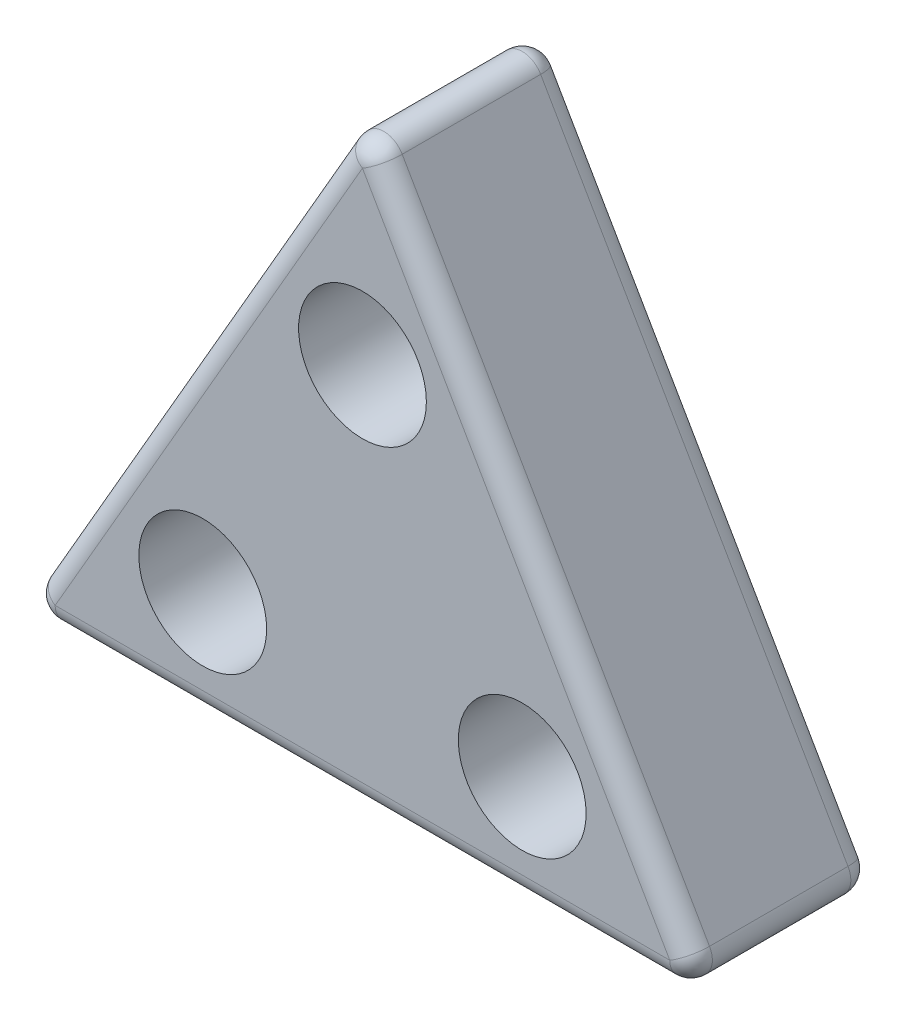
ISO-10303-21;
HEADER;
FILE_DESCRIPTION(('STEP AP214'),'2;1');
FILE_NAME('part.step','',(''),(''),'','','');
FILE_SCHEMA(('AUTOMOTIVE_DESIGN { 1 0 10303 214 1 1 1 1 }'));
ENDSEC;
DATA;
#1=APPLICATION_CONTEXT('core data for automotive mechanical design processes');
#2=APPLICATION_PROTOCOL_DEFINITION('international standard','automotive_design',2000,#1);
#3=PRODUCT_CONTEXT('',#1,'mechanical');
#4=PRODUCT('Part','Part','',(#3));
#5=PRODUCT_RELATED_PRODUCT_CATEGORY('part','',(#4));
#6=PRODUCT_DEFINITION_FORMATION('','',#4);
#7=PRODUCT_DEFINITION_CONTEXT('part definition',#1,'design');
#8=PRODUCT_DEFINITION('design','',#6,#7);
#9=PRODUCT_DEFINITION_SHAPE('','',#8);
#10=(LENGTH_UNIT() NAMED_UNIT(*) SI_UNIT(.MILLI.,.METRE.));
#11=(NAMED_UNIT(*) PLANE_ANGLE_UNIT() SI_UNIT($,.RADIAN.));
#12=(NAMED_UNIT(*) SI_UNIT($,.STERADIAN.) SOLID_ANGLE_UNIT());
#13=UNCERTAINTY_MEASURE_WITH_UNIT(LENGTH_MEASURE(1.E-05),#10,'distance_accuracy_value','');
#14=(GEOMETRIC_REPRESENTATION_CONTEXT(3) GLOBAL_UNCERTAINTY_ASSIGNED_CONTEXT((#13)) GLOBAL_UNIT_ASSIGNED_CONTEXT((#10,
#11,#12)) REPRESENTATION_CONTEXT('',''));
#15=CARTESIAN_POINT('',(0.,0.,0.));
#16=DIRECTION('',(0.,0.,1.));
#17=DIRECTION('',(1.,0.,0.));
#18=AXIS2_PLACEMENT_3D('',#15,#16,#17);
#19=CARTESIAN_POINT('',(0.,20.9903810567666,8.5));
#20=DIRECTION('',(0.,0.,-1.));
#21=DIRECTION('',(-1.,0.,0.));
#22=AXIS2_PLACEMENT_3D('',#19,#20,#21);
#23=PLANE('',#22);
#24=DIRECTION('',(-0.499999999999998,-0.86602540378444,0.));
#25=VECTOR('',#24,1.);
#26=CARTESIAN_POINT('',(0.,20.9903810567666,8.5));
#27=LINE('',#26,#25);
#28=CARTESIAN_POINT('',(0.,20.9903810567666,8.5));
#29=VERTEX_POINT('',#28);
#30=CARTESIAN_POINT('',(-14.4282032302755,-4.,8.5));
#31=VERTEX_POINT('',#30);
#32=EDGE_CURVE('E58',#29,#31,#27,.T.);
#33=ORIENTED_EDGE('',*,*,#32,.T.);
#34=DIRECTION('',(1.,0.,0.));
#35=VECTOR('',#34,1.);
#36=CARTESIAN_POINT('',(0.,-4.,8.5));
#37=LINE('',#36,#35);
#38=CARTESIAN_POINT('',(14.4282032302755,-4.,8.5));
#39=VERTEX_POINT('',#38);
#40=EDGE_CURVE('E122',#31,#39,#37,.T.);
#41=ORIENTED_EDGE('',*,*,#40,.T.);
#42=DIRECTION('',(-0.500000000000001,0.866025403784438,0.));
#43=VECTOR('',#42,1.);
#44=CARTESIAN_POINT('',(0.,20.9903810567666,8.5));
#45=LINE('',#44,#43);
#46=EDGE_CURVE('E62',#39,#29,#45,.T.);
#47=ORIENTED_EDGE('',*,*,#46,.T.);
#48=EDGE_LOOP('',(#33,#41,#47));
#49=FACE_BOUND('',#48,.T.);
#50=CARTESIAN_POINT('',(-7.5,0.,8.5));
#51=DIRECTION('',(0.,0.,1.));
#52=DIRECTION('',(1.,0.,0.));
#53=AXIS2_PLACEMENT_3D('',#50,#51,#52);
#54=CIRCLE('',#53,3.);
#55=CARTESIAN_POINT('',(-4.5,0.,8.5));
#56=VERTEX_POINT('',#55);
#57=EDGE_CURVE('E205',#56,#56,#54,.T.);
#58=ORIENTED_EDGE('',*,*,#57,.F.);
#59=EDGE_LOOP('',(#58));
#60=FACE_BOUND('',#59,.T.);
#61=CARTESIAN_POINT('',(7.5,0.,8.5));
#62=DIRECTION('',(0.,0.,1.));
#63=DIRECTION('',(1.,0.,0.));
#64=AXIS2_PLACEMENT_3D('',#61,#62,#63);
#65=CIRCLE('',#64,3.);
#66=CARTESIAN_POINT('',(10.5,0.,8.5));
#67=VERTEX_POINT('',#66);
#68=EDGE_CURVE('E199',#67,#67,#65,.T.);
#69=ORIENTED_EDGE('',*,*,#68,.F.);
#70=EDGE_LOOP('',(#69));
#71=FACE_BOUND('',#70,.T.);
#72=CARTESIAN_POINT('',(0.,12.9903810567666,8.5));
#73=DIRECTION('',(0.,0.,1.));
#74=DIRECTION('',(1.,0.,0.));
#75=AXIS2_PLACEMENT_3D('',#72,#73,#74);
#76=CIRCLE('',#75,3.);
#77=CARTESIAN_POINT('',(2.99999999999997,12.9903810567666,8.5));
#78=VERTEX_POINT('',#77);
#79=EDGE_CURVE('E191',#78,#78,#76,.T.);
#80=ORIENTED_EDGE('',*,*,#79,.F.);
#81=EDGE_LOOP('',(#80));
#82=FACE_BOUND('',#81,.T.);
#83=ADVANCED_FACE('F41',(#49,#60,#71,#82),#23,.F.);
#84=CARTESIAN_POINT('',(0.,20.9903810567666,0.));
#85=DIRECTION('',(0.,0.,-1.));
#86=DIRECTION('',(-1.,0.,0.));
#87=AXIS2_PLACEMENT_3D('',#84,#85,#86);
#88=PLANE('',#87);
#89=DIRECTION('',(-0.500000000000001,0.866025403784438,0.));
#90=VECTOR('',#89,1.);
#91=CARTESIAN_POINT('',(14.4282032302755,-4.00000000000001,0.));
#92=LINE('',#91,#90);
#93=CARTESIAN_POINT('',(0.,20.9903810567666,0.));
#94=VERTEX_POINT('',#93);
#95=CARTESIAN_POINT('',(14.4282032302755,-4.,0.));
#96=VERTEX_POINT('',#95);
#97=EDGE_CURVE('E225',#94,#96,#92,.F.);
#98=ORIENTED_EDGE('',*,*,#97,.T.);
#99=DIRECTION('',(1.,0.,0.));
#100=VECTOR('',#99,1.);
#101=CARTESIAN_POINT('',(-14.4282032302755,-4.,0.));
#102=LINE('',#101,#100);
#103=CARTESIAN_POINT('',(-14.4282032302755,-4.,0.));
#104=VERTEX_POINT('',#103);
#105=EDGE_CURVE('E229',#96,#104,#102,.F.);
#106=ORIENTED_EDGE('',*,*,#105,.T.);
#107=DIRECTION('',(-0.499999999999998,-0.86602540378444,0.));
#108=VECTOR('',#107,1.);
#109=CARTESIAN_POINT('',(0.,20.9903810567666,0.));
#110=LINE('',#109,#108);
#111=EDGE_CURVE('E227',#104,#94,#110,.F.);
#112=ORIENTED_EDGE('',*,*,#111,.T.);
#113=EDGE_LOOP('',(#98,#106,#112));
#114=FACE_BOUND('',#113,.T.);
#115=CARTESIAN_POINT('',(7.5,0.,0.));
#116=DIRECTION('',(0.,0.,1.));
#117=DIRECTION('',(1.,0.,0.));
#118=AXIS2_PLACEMENT_3D('',#115,#116,#117);
#119=CIRCLE('',#118,3.);
#120=CARTESIAN_POINT('',(10.5,0.,0.));
#121=VERTEX_POINT('',#120);
#122=EDGE_CURVE('E196',#121,#121,#119,.T.);
#123=ORIENTED_EDGE('',*,*,#122,.T.);
#124=EDGE_LOOP('',(#123));
#125=FACE_BOUND('',#124,.T.);
#126=CARTESIAN_POINT('',(-7.5,0.,0.));
#127=DIRECTION('',(0.,0.,1.));
#128=DIRECTION('',(1.,0.,0.));
#129=AXIS2_PLACEMENT_3D('',#126,#127,#128);
#130=CIRCLE('',#129,3.);
#131=CARTESIAN_POINT('',(-4.5,0.,0.));
#132=VERTEX_POINT('',#131);
#133=EDGE_CURVE('E202',#132,#132,#130,.T.);
#134=ORIENTED_EDGE('',*,*,#133,.T.);
#135=EDGE_LOOP('',(#134));
#136=FACE_BOUND('',#135,.T.);
#137=CARTESIAN_POINT('',(0.,12.9903810567666,0.));
#138=DIRECTION('',(0.,0.,1.));
#139=DIRECTION('',(1.,0.,0.));
#140=AXIS2_PLACEMENT_3D('',#137,#138,#139);
#141=CIRCLE('',#140,3.);
#142=CARTESIAN_POINT('',(2.99999999999997,12.9903810567666,0.));
#143=VERTEX_POINT('',#142);
#144=EDGE_CURVE('E184',#143,#143,#141,.T.);
#145=ORIENTED_EDGE('',*,*,#144,.T.);
#146=EDGE_LOOP('',(#145));
#147=FACE_BOUND('',#146,.T.);
#148=ADVANCED_FACE('F267',(#114,#125,#136,#147),#88,.T.);
#149=CARTESIAN_POINT('',(0.,20.9903810567666,8.5));
#150=DIRECTION('',(0.,0.,-1.));
#151=DIRECTION('',(-1.,0.,0.));
#152=AXIS2_PLACEMENT_3D('',#149,#150,#151);
#153=CYLINDRICAL_SURFACE('',#152,1.);
#154=DIRECTION('',(0.,0.,-1.));
#155=VECTOR('',#154,1.);
#156=CARTESIAN_POINT('',(0.866025403784391,21.4903810567666,8.5));
#157=LINE('',#156,#155);
#158=CARTESIAN_POINT('',(0.866025403784391,21.4903810567666,7.5));
#159=VERTEX_POINT('',#158);
#160=CARTESIAN_POINT('',(0.866025403784391,21.4903810567666,1.));
#161=VERTEX_POINT('',#160);
#162=EDGE_CURVE('E117',#159,#161,#157,.T.);
#163=ORIENTED_EDGE('',*,*,#162,.T.);
#164=CARTESIAN_POINT('',(0.,20.9903810567666,1.));
#165=DIRECTION('',(0.,0.,-1.));
#166=DIRECTION('',(-1.,0.,0.));
#167=AXIS2_PLACEMENT_3D('',#164,#165,#166);
#168=CIRCLE('',#167,1.);
#169=CARTESIAN_POINT('',(-0.866025403784487,21.4903810567666,1.));
#170=VERTEX_POINT('',#169);
#171=EDGE_CURVE('E242',#161,#170,#168,.F.);
#172=ORIENTED_EDGE('',*,*,#171,.T.);
#173=DIRECTION('',(0.,0.,-1.));
#174=VECTOR('',#173,1.);
#175=CARTESIAN_POINT('',(-0.866025403784487,21.4903810567666,8.5));
#176=LINE('',#175,#174);
#177=CARTESIAN_POINT('',(-0.866025403784487,21.4903810567666,7.5));
#178=VERTEX_POINT('',#177);
#179=EDGE_CURVE('E142',#178,#170,#176,.T.);
#180=ORIENTED_EDGE('',*,*,#179,.F.);
#181=CARTESIAN_POINT('',(0.,20.9903810567666,7.5));
#182=DIRECTION('',(0.,0.,-1.));
#183=DIRECTION('',(-1.,0.,0.));
#184=AXIS2_PLACEMENT_3D('',#181,#182,#183);
#185=CIRCLE('',#184,1.);
#186=EDGE_CURVE('E240',#178,#159,#185,.T.);
#187=ORIENTED_EDGE('',*,*,#186,.T.);
#188=EDGE_LOOP('',(#163,#172,#180,#187));
#189=FACE_BOUND('',#188,.T.);
#190=ADVANCED_FACE('F273',(#189),#153,.T.);
#191=CARTESIAN_POINT('',(-15.2942286340599,-3.5,8.5));
#192=DIRECTION('',(0.86602540378444,-0.499999999999998,0.));
#193=DIRECTION('',(0.499999999999998,0.86602540378444,0.));
#194=AXIS2_PLACEMENT_3D('',#191,#192,#193);
#195=PLANE('',#194);
#196=ORIENTED_EDGE('',*,*,#179,.T.);
#197=DIRECTION('',(-0.499999999999998,-0.86602540378444,0.));
#198=VECTOR('',#197,1.);
#199=CARTESIAN_POINT('',(-15.2942286340599,-3.5,1.));
#200=LINE('',#199,#198);
#201=CARTESIAN_POINT('',(-15.2942286340599,-3.5,1.));
#202=VERTEX_POINT('',#201);
#203=EDGE_CURVE('E238',#170,#202,#200,.T.);
#204=ORIENTED_EDGE('',*,*,#203,.T.);
#205=DIRECTION('',(0.,0.,-1.));
#206=VECTOR('',#205,1.);
#207=CARTESIAN_POINT('',(-15.2942286340599,-3.5,8.5));
#208=LINE('',#207,#206);
#209=CARTESIAN_POINT('',(-15.2942286340599,-3.5,7.5));
#210=VERTEX_POINT('',#209);
#211=EDGE_CURVE('E215',#210,#202,#208,.T.);
#212=ORIENTED_EDGE('',*,*,#211,.F.);
#213=DIRECTION('',(-0.499999999999998,-0.86602540378444,0.));
#214=VECTOR('',#213,1.);
#215=CARTESIAN_POINT('',(-15.2942286340599,-3.5,7.5));
#216=LINE('',#215,#214);
#217=EDGE_CURVE('E236',#210,#178,#216,.F.);
#218=ORIENTED_EDGE('',*,*,#217,.T.);
#219=EDGE_LOOP('',(#196,#204,#212,#218));
#220=FACE_BOUND('',#219,.T.);
#221=ADVANCED_FACE('F288',(#220),#195,.F.);
#222=CARTESIAN_POINT('',(-14.4282032302755,-4.,8.5));
#223=DIRECTION('',(0.,0.,-1.));
#224=DIRECTION('',(-1.,0.,0.));
#225=AXIS2_PLACEMENT_3D('',#222,#223,#224);
#226=CYLINDRICAL_SURFACE('',#225,1.);
#227=ORIENTED_EDGE('',*,*,#211,.T.);
#228=CARTESIAN_POINT('',(-14.4282032302755,-4.,1.));
#229=DIRECTION('',(0.,0.,-1.));
#230=DIRECTION('',(-1.,0.,0.));
#231=AXIS2_PLACEMENT_3D('',#228,#229,#230);
#232=CIRCLE('',#231,1.);
#233=CARTESIAN_POINT('',(-14.4282032302755,-5.,1.));
#234=VERTEX_POINT('',#233);
#235=EDGE_CURVE('E234',#202,#234,#232,.F.);
#236=ORIENTED_EDGE('',*,*,#235,.T.);
#237=DIRECTION('',(0.,0.,-1.));
#238=VECTOR('',#237,1.);
#239=CARTESIAN_POINT('',(-14.4282032302755,-5.,8.5));
#240=LINE('',#239,#238);
#241=CARTESIAN_POINT('',(-14.4282032302755,-5.,7.5));
#242=VERTEX_POINT('',#241);
#243=EDGE_CURVE('E212',#242,#234,#240,.T.);
#244=ORIENTED_EDGE('',*,*,#243,.F.);
#245=CARTESIAN_POINT('',(-14.4282032302755,-4.,7.5));
#246=DIRECTION('',(0.,0.,-1.));
#247=DIRECTION('',(-1.,0.,0.));
#248=AXIS2_PLACEMENT_3D('',#245,#246,#247);
#249=CIRCLE('',#248,1.);
#250=EDGE_CURVE('E232',#242,#210,#249,.T.);
#251=ORIENTED_EDGE('',*,*,#250,.T.);
#252=EDGE_LOOP('',(#227,#236,#244,#251));
#253=FACE_BOUND('',#252,.T.);
#254=ADVANCED_FACE('F254',(#253),#226,.T.);
#255=CARTESIAN_POINT('',(-14.4282032302755,-5.,8.5));
#256=DIRECTION('',(0.,1.,0.));
#257=DIRECTION('',(-1.,0.,0.));
#258=AXIS2_PLACEMENT_3D('',#255,#256,#257);
#259=PLANE('',#258);
#260=ORIENTED_EDGE('',*,*,#243,.T.);
#261=DIRECTION('',(1.,0.,0.));
#262=VECTOR('',#261,1.);
#263=CARTESIAN_POINT('',(14.4282032302755,-5.,1.));
#264=LINE('',#263,#262);
#265=CARTESIAN_POINT('',(14.4282032302755,-5.,1.));
#266=VERTEX_POINT('',#265);
#267=EDGE_CURVE('E223',#234,#266,#264,.T.);
#268=ORIENTED_EDGE('',*,*,#267,.T.);
#269=DIRECTION('',(0.,0.,-1.));
#270=VECTOR('',#269,1.);
#271=CARTESIAN_POINT('',(14.4282032302755,-5.,8.5));
#272=LINE('',#271,#270);
#273=CARTESIAN_POINT('',(14.4282032302755,-5.,7.5));
#274=VERTEX_POINT('',#273);
#275=EDGE_CURVE('E134',#274,#266,#272,.T.);
#276=ORIENTED_EDGE('',*,*,#275,.F.);
#277=DIRECTION('',(1.,0.,0.));
#278=VECTOR('',#277,1.);
#279=CARTESIAN_POINT('',(-14.4282032302755,-5.,7.5));
#280=LINE('',#279,#278);
#281=EDGE_CURVE('E221',#274,#242,#280,.F.);
#282=ORIENTED_EDGE('',*,*,#281,.T.);
#283=EDGE_LOOP('',(#260,#268,#276,#282));
#284=FACE_BOUND('',#283,.T.);
#285=ADVANCED_FACE('F252',(#284),#259,.F.);
#286=CARTESIAN_POINT('',(14.4282032302755,-4.,8.5));
#287=DIRECTION('',(0.,0.,-1.));
#288=DIRECTION('',(-1.,0.,0.));
#289=AXIS2_PLACEMENT_3D('',#286,#287,#288);
#290=CYLINDRICAL_SURFACE('',#289,0.999999999999998);
#291=ORIENTED_EDGE('',*,*,#275,.T.);
#292=CARTESIAN_POINT('',(14.4282032302755,-4.,1.));
#293=DIRECTION('',(0.,0.,-1.));
#294=DIRECTION('',(-1.,0.,0.));
#295=AXIS2_PLACEMENT_3D('',#292,#293,#294);
#296=CIRCLE('',#295,0.999999999999998);
#297=CARTESIAN_POINT('',(15.29422863406,-3.5,1.));
#298=VERTEX_POINT('',#297);
#299=EDGE_CURVE('E133',#266,#298,#296,.F.);
#300=ORIENTED_EDGE('',*,*,#299,.T.);
#301=DIRECTION('',(0.,0.,-1.));
#302=VECTOR('',#301,1.);
#303=CARTESIAN_POINT('',(15.29422863406,-3.5,8.5));
#304=LINE('',#303,#302);
#305=CARTESIAN_POINT('',(15.29422863406,-3.5,7.5));
#306=VERTEX_POINT('',#305);
#307=EDGE_CURVE('E115',#306,#298,#304,.T.);
#308=ORIENTED_EDGE('',*,*,#307,.F.);
#309=CARTESIAN_POINT('',(14.4282032302755,-4.,7.5));
#310=DIRECTION('',(0.,0.,-1.));
#311=DIRECTION('',(-1.,0.,0.));
#312=AXIS2_PLACEMENT_3D('',#309,#310,#311);
#313=CIRCLE('',#312,0.999999999999998);
#314=EDGE_CURVE('E130',#306,#274,#313,.T.);
#315=ORIENTED_EDGE('',*,*,#314,.T.);
#316=EDGE_LOOP('',(#291,#300,#308,#315));
#317=FACE_BOUND('',#316,.T.);
#318=ADVANCED_FACE('F129',(#317),#290,.T.);
#319=CARTESIAN_POINT('',(0.866025403784391,21.4903810567666,8.5));
#320=DIRECTION('',(-0.866025403784438,-0.500000000000001,0.));
#321=DIRECTION('',(0.500000000000001,-0.866025403784438,0.));
#322=AXIS2_PLACEMENT_3D('',#319,#320,#321);
#323=PLANE('',#322);
#324=ORIENTED_EDGE('',*,*,#307,.T.);
#325=DIRECTION('',(-0.500000000000001,0.866025403784438,0.));
#326=VECTOR('',#325,1.);
#327=CARTESIAN_POINT('',(0.866025403784391,21.4903810567666,1.));
#328=LINE('',#327,#326);
#329=EDGE_CURVE('E11',#298,#161,#328,.T.);
#330=ORIENTED_EDGE('',*,*,#329,.T.);
#331=ORIENTED_EDGE('',*,*,#162,.F.);
#332=DIRECTION('',(-0.500000000000001,0.866025403784438,0.));
#333=VECTOR('',#332,1.);
#334=CARTESIAN_POINT('',(0.866025403784391,21.4903810567666,7.5));
#335=LINE('',#334,#333);
#336=EDGE_CURVE('E50',#159,#306,#335,.F.);
#337=ORIENTED_EDGE('',*,*,#336,.T.);
#338=EDGE_LOOP('',(#324,#330,#331,#337));
#339=FACE_BOUND('',#338,.T.);
#340=ADVANCED_FACE('F114',(#339),#323,.F.);
#341=CARTESIAN_POINT('',(-7.5,0.,8.5));
#342=DIRECTION('',(0.,0.,-1.));
#343=DIRECTION('',(-1.,0.,0.));
#344=AXIS2_PLACEMENT_3D('',#341,#342,#343);
#345=CYLINDRICAL_SURFACE('',#344,3.);
#346=ORIENTED_EDGE('',*,*,#57,.T.);
#347=EDGE_LOOP('',(#346));
#348=FACE_BOUND('',#347,.T.);
#349=ORIENTED_EDGE('',*,*,#133,.F.);
#350=EDGE_LOOP('',(#349));
#351=FACE_BOUND('',#350,.T.);
#352=ADVANCED_FACE('F277',(#348,#351),#345,.F.);
#353=CARTESIAN_POINT('',(7.5,0.,8.5));
#354=DIRECTION('',(0.,0.,-1.));
#355=DIRECTION('',(-1.,0.,0.));
#356=AXIS2_PLACEMENT_3D('',#353,#354,#355);
#357=CYLINDRICAL_SURFACE('',#356,3.);
#358=ORIENTED_EDGE('',*,*,#68,.T.);
#359=EDGE_LOOP('',(#358));
#360=FACE_BOUND('',#359,.T.);
#361=ORIENTED_EDGE('',*,*,#122,.F.);
#362=EDGE_LOOP('',(#361));
#363=FACE_BOUND('',#362,.T.);
#364=ADVANCED_FACE('F388',(#360,#363),#357,.F.);
#365=CARTESIAN_POINT('',(0.,12.9903810567666,8.5));
#366=DIRECTION('',(0.,0.,-1.));
#367=DIRECTION('',(-1.,0.,0.));
#368=AXIS2_PLACEMENT_3D('',#365,#366,#367);
#369=CYLINDRICAL_SURFACE('',#368,3.);
#370=ORIENTED_EDGE('',*,*,#79,.T.);
#371=EDGE_LOOP('',(#370));
#372=FACE_BOUND('',#371,.T.);
#373=ORIENTED_EDGE('',*,*,#144,.F.);
#374=EDGE_LOOP('',(#373));
#375=FACE_BOUND('',#374,.T.);
#376=ADVANCED_FACE('F314',(#372,#375),#369,.F.);
#377=CARTESIAN_POINT('',(-14.4282032302755,-4.,1.));
#378=DIRECTION('',(0.499999999999998,0.86602540378444,0.));
#379=DIRECTION('',(-0.86602540378444,0.499999999999998,0.));
#380=AXIS2_PLACEMENT_3D('',#377,#378,#379);
#381=CYLINDRICAL_SURFACE('',#380,1.);
#382=CARTESIAN_POINT('',(-14.4282032302755,-4.,1.));
#383=DIRECTION('',(-0.499999999999998,-0.86602540378444,0.));
#384=DIRECTION('',(0.86602540378444,-0.499999999999998,0.));
#385=AXIS2_PLACEMENT_3D('',#382,#383,#384);
#386=CIRCLE('',#385,1.);
#387=EDGE_CURVE('E149',#202,#104,#386,.T.);
#388=ORIENTED_EDGE('',*,*,#387,.F.);
#389=ORIENTED_EDGE('',*,*,#203,.F.);
#390=CARTESIAN_POINT('',(0.,20.9903810567666,1.));
#391=DIRECTION('',(0.499999999999998,0.86602540378444,0.));
#392=DIRECTION('',(-0.86602540378444,0.499999999999998,0.));
#393=AXIS2_PLACEMENT_3D('',#390,#391,#392);
#394=CIRCLE('',#393,1.);
#395=EDGE_CURVE('E177',#94,#170,#394,.T.);
#396=ORIENTED_EDGE('',*,*,#395,.F.);
#397=ORIENTED_EDGE('',*,*,#111,.F.);
#398=EDGE_LOOP('',(#388,#389,#396,#397));
#399=FACE_BOUND('',#398,.T.);
#400=ADVANCED_FACE('F311',(#399),#381,.T.);
#401=CARTESIAN_POINT('',(-14.4282032302755,-4.,1.));
#402=DIRECTION('',(0.,0.,-1.));
#403=DIRECTION('',(-1.,0.,0.));
#404=AXIS2_PLACEMENT_3D('',#401,#402,#403);
#405=SPHERICAL_SURFACE('',#404,1.);
#406=ORIENTED_EDGE('',*,*,#235,.F.);
#407=ORIENTED_EDGE('',*,*,#387,.T.);
#408=CARTESIAN_POINT('',(-14.4282032302755,-4.,1.));
#409=DIRECTION('',(1.,0.,0.));
#410=DIRECTION('',(0.,0.,-1.));
#411=AXIS2_PLACEMENT_3D('',#408,#409,#410);
#412=CIRCLE('',#411,1.);
#413=EDGE_CURVE('E176',#234,#104,#412,.T.);
#414=ORIENTED_EDGE('',*,*,#413,.F.);
#415=EDGE_LOOP('',(#406,#407,#414));
#416=FACE_BOUND('',#415,.T.);
#417=ADVANCED_FACE('F308',(#416),#405,.T.);
#418=CARTESIAN_POINT('',(0.,20.9903810567666,1.));
#419=DIRECTION('',(0.,0.,-1.));
#420=DIRECTION('',(-1.,0.,0.));
#421=AXIS2_PLACEMENT_3D('',#418,#419,#420);
#422=SPHERICAL_SURFACE('',#421,1.);
#423=ORIENTED_EDGE('',*,*,#395,.T.);
#424=ORIENTED_EDGE('',*,*,#171,.F.);
#425=CARTESIAN_POINT('',(0.,20.9903810567666,1.));
#426=DIRECTION('',(0.500000000000001,-0.866025403784438,0.));
#427=DIRECTION('',(0.866025403784438,0.500000000000001,0.));
#428=AXIS2_PLACEMENT_3D('',#425,#426,#427);
#429=CIRCLE('',#428,1.);
#430=EDGE_CURVE('E171',#94,#161,#429,.T.);
#431=ORIENTED_EDGE('',*,*,#430,.F.);
#432=EDGE_LOOP('',(#423,#424,#431));
#433=FACE_BOUND('',#432,.T.);
#434=ADVANCED_FACE('F304',(#433),#422,.T.);
#435=CARTESIAN_POINT('',(-14.4282032302755,-4.,1.));
#436=DIRECTION('',(-1.,0.,0.));
#437=DIRECTION('',(0.,-1.,0.));
#438=AXIS2_PLACEMENT_3D('',#435,#436,#437);
#439=CYLINDRICAL_SURFACE('',#438,1.);
#440=ORIENTED_EDGE('',*,*,#413,.T.);
#441=ORIENTED_EDGE('',*,*,#105,.F.);
#442=CARTESIAN_POINT('',(14.4282032302755,-4.,1.));
#443=DIRECTION('',(1.,0.,0.));
#444=DIRECTION('',(0.,0.,-1.));
#445=AXIS2_PLACEMENT_3D('',#442,#443,#444);
#446=CIRCLE('',#445,1.);
#447=EDGE_CURVE('E165',#266,#96,#446,.T.);
#448=ORIENTED_EDGE('',*,*,#447,.F.);
#449=ORIENTED_EDGE('',*,*,#267,.F.);
#450=EDGE_LOOP('',(#440,#441,#448,#449));
#451=FACE_BOUND('',#450,.T.);
#452=ADVANCED_FACE('F300',(#451),#439,.T.);
#453=CARTESIAN_POINT('',(0.,20.9903810567666,1.));
#454=DIRECTION('',(0.500000000000001,-0.866025403784438,0.));
#455=DIRECTION('',(0.866025403784438,0.500000000000001,0.));
#456=AXIS2_PLACEMENT_3D('',#453,#454,#455);
#457=CYLINDRICAL_SURFACE('',#456,1.);
#458=ORIENTED_EDGE('',*,*,#430,.T.);
#459=ORIENTED_EDGE('',*,*,#329,.F.);
#460=CARTESIAN_POINT('',(14.4282032302755,-4.,1.));
#461=DIRECTION('',(0.500000000000002,-0.866025403784438,0.));
#462=DIRECTION('',(0.866025403784438,0.500000000000002,0.));
#463=AXIS2_PLACEMENT_3D('',#460,#461,#462);
#464=CIRCLE('',#463,1.);
#465=EDGE_CURVE('E161',#96,#298,#464,.T.);
#466=ORIENTED_EDGE('',*,*,#465,.F.);
#467=ORIENTED_EDGE('',*,*,#97,.F.);
#468=EDGE_LOOP('',(#458,#459,#466,#467));
#469=FACE_BOUND('',#468,.T.);
#470=ADVANCED_FACE('F297',(#469),#457,.T.);
#471=CARTESIAN_POINT('',(14.4282032302755,-4.,1.));
#472=DIRECTION('',(0.,0.,-1.));
#473=DIRECTION('',(-1.,0.,0.));
#474=AXIS2_PLACEMENT_3D('',#471,#472,#473);
#475=SPHERICAL_SURFACE('',#474,1.);
#476=ORIENTED_EDGE('',*,*,#299,.F.);
#477=ORIENTED_EDGE('',*,*,#447,.T.);
#478=ORIENTED_EDGE('',*,*,#465,.T.);
#479=EDGE_LOOP('',(#476,#477,#478));
#480=FACE_BOUND('',#479,.T.);
#481=ADVANCED_FACE('F264',(#480),#475,.T.);
#482=CARTESIAN_POINT('',(0.,20.9903810567666,7.5));
#483=DIRECTION('',(-0.499999999999998,-0.86602540378444,0.));
#484=DIRECTION('',(0.86602540378444,-0.499999999999998,0.));
#485=AXIS2_PLACEMENT_3D('',#482,#483,#484);
#486=CYLINDRICAL_SURFACE('',#485,1.);
#487=CARTESIAN_POINT('',(0.,20.9903810567666,7.5));
#488=DIRECTION('',(0.499999999999997,0.86602540378444,0.));
#489=DIRECTION('',(-0.86602540378444,0.499999999999997,0.));
#490=AXIS2_PLACEMENT_3D('',#487,#488,#489);
#491=CIRCLE('',#490,1.);
#492=EDGE_CURVE('E155',#178,#29,#491,.T.);
#493=ORIENTED_EDGE('',*,*,#492,.F.);
#494=ORIENTED_EDGE('',*,*,#217,.F.);
#495=CARTESIAN_POINT('',(-14.4282032302755,-4.,7.5));
#496=DIRECTION('',(-0.499999999999999,-0.866025403784439,0.));
#497=DIRECTION('',(0.866025403784439,-0.499999999999999,0.));
#498=AXIS2_PLACEMENT_3D('',#495,#496,#497);
#499=CIRCLE('',#498,1.);
#500=EDGE_CURVE('E45',#31,#210,#499,.T.);
#501=ORIENTED_EDGE('',*,*,#500,.F.);
#502=ORIENTED_EDGE('',*,*,#32,.F.);
#503=EDGE_LOOP('',(#493,#494,#501,#502));
#504=FACE_BOUND('',#503,.T.);
#505=ADVANCED_FACE('F43',(#504),#486,.T.);
#506=CARTESIAN_POINT('',(-14.4282032302755,-4.,7.5));
#507=DIRECTION('',(0.,0.,-1.));
#508=DIRECTION('',(-1.,0.,0.));
#509=AXIS2_PLACEMENT_3D('',#506,#507,#508);
#510=SPHERICAL_SURFACE('',#509,1.);
#511=ORIENTED_EDGE('',*,*,#500,.T.);
#512=ORIENTED_EDGE('',*,*,#250,.F.);
#513=CARTESIAN_POINT('',(-14.4282032302755,-4.,7.5));
#514=DIRECTION('',(1.,0.,0.));
#515=DIRECTION('',(0.,0.,-1.));
#516=AXIS2_PLACEMENT_3D('',#513,#514,#515);
#517=CIRCLE('',#516,1.);
#518=EDGE_CURVE('E153',#31,#242,#517,.T.);
#519=ORIENTED_EDGE('',*,*,#518,.F.);
#520=EDGE_LOOP('',(#511,#512,#519));
#521=FACE_BOUND('',#520,.T.);
#522=ADVANCED_FACE('F256',(#521),#510,.T.);
#523=CARTESIAN_POINT('',(0.,20.9903810567666,7.5));
#524=DIRECTION('',(0.,0.,-1.));
#525=DIRECTION('',(-1.,0.,0.));
#526=AXIS2_PLACEMENT_3D('',#523,#524,#525);
#527=SPHERICAL_SURFACE('',#526,1.);
#528=ORIENTED_EDGE('',*,*,#186,.F.);
#529=ORIENTED_EDGE('',*,*,#492,.T.);
#530=CARTESIAN_POINT('',(0.,20.9903810567666,7.5));
#531=DIRECTION('',(0.500000000000001,-0.866025403784438,0.));
#532=DIRECTION('',(0.866025403784438,0.500000000000001,0.));
#533=AXIS2_PLACEMENT_3D('',#530,#531,#532);
#534=CIRCLE('',#533,1.);
#535=EDGE_CURVE('E146',#159,#29,#534,.T.);
#536=ORIENTED_EDGE('',*,*,#535,.F.);
#537=EDGE_LOOP('',(#528,#529,#536));
#538=FACE_BOUND('',#537,.T.);
#539=ADVANCED_FACE('F258',(#538),#527,.T.);
#540=CARTESIAN_POINT('',(0.,-4.,7.5));
#541=DIRECTION('',(1.,0.,0.));
#542=DIRECTION('',(0.,1.,0.));
#543=AXIS2_PLACEMENT_3D('',#540,#541,#542);
#544=CYLINDRICAL_SURFACE('',#543,1.);
#545=ORIENTED_EDGE('',*,*,#518,.T.);
#546=ORIENTED_EDGE('',*,*,#281,.F.);
#547=CARTESIAN_POINT('',(14.4282032302755,-4.,7.5));
#548=DIRECTION('',(1.,0.,0.));
#549=DIRECTION('',(0.,0.,-1.));
#550=AXIS2_PLACEMENT_3D('',#547,#548,#549);
#551=CIRCLE('',#550,1.);
#552=EDGE_CURVE('E140',#39,#274,#551,.T.);
#553=ORIENTED_EDGE('',*,*,#552,.F.);
#554=ORIENTED_EDGE('',*,*,#40,.F.);
#555=EDGE_LOOP('',(#545,#546,#553,#554));
#556=FACE_BOUND('',#555,.T.);
#557=ADVANCED_FACE('F249',(#556),#544,.T.);
#558=CARTESIAN_POINT('',(0.,20.9903810567666,7.5));
#559=DIRECTION('',(-0.500000000000001,0.866025403784438,0.));
#560=DIRECTION('',(-0.866025403784438,-0.500000000000001,0.));
#561=AXIS2_PLACEMENT_3D('',#558,#559,#560);
#562=CYLINDRICAL_SURFACE('',#561,1.);
#563=ORIENTED_EDGE('',*,*,#535,.T.);
#564=ORIENTED_EDGE('',*,*,#46,.F.);
#565=CARTESIAN_POINT('',(14.4282032302755,-4.,7.5));
#566=DIRECTION('',(0.500000000000001,-0.866025403784438,0.));
#567=DIRECTION('',(0.866025403784438,0.500000000000001,0.));
#568=AXIS2_PLACEMENT_3D('',#565,#566,#567);
#569=CIRCLE('',#568,1.);
#570=EDGE_CURVE('E138',#306,#39,#569,.T.);
#571=ORIENTED_EDGE('',*,*,#570,.F.);
#572=ORIENTED_EDGE('',*,*,#336,.F.);
#573=EDGE_LOOP('',(#563,#564,#571,#572));
#574=FACE_BOUND('',#573,.T.);
#575=ADVANCED_FACE('F144',(#574),#562,.T.);
#576=CARTESIAN_POINT('',(14.4282032302755,-4.,7.5));
#577=DIRECTION('',(0.,0.,-1.));
#578=DIRECTION('',(-1.,0.,0.));
#579=AXIS2_PLACEMENT_3D('',#576,#577,#578);
#580=SPHERICAL_SURFACE('',#579,1.);
#581=ORIENTED_EDGE('',*,*,#552,.T.);
#582=ORIENTED_EDGE('',*,*,#314,.F.);
#583=ORIENTED_EDGE('',*,*,#570,.T.);
#584=EDGE_LOOP('',(#581,#582,#583));
#585=FACE_BOUND('',#584,.T.);
#586=ADVANCED_FACE('F137',(#585),#580,.T.);
#587=CLOSED_SHELL('',(#83,#148,#190,#221,#254,#285,#318,#340,#352,#364,#376,#400,#417,#434,#452,
#470,#481,#505,#522,#539,#557,#575,#586));
#588=MANIFOLD_SOLID_BREP('B2',#587);
#589=ADVANCED_BREP_SHAPE_REPRESENTATION('',(#18,#588),#14);
#590=SHAPE_DEFINITION_REPRESENTATION(#9,#589);
ENDSEC;
END-ISO-10303-21;
